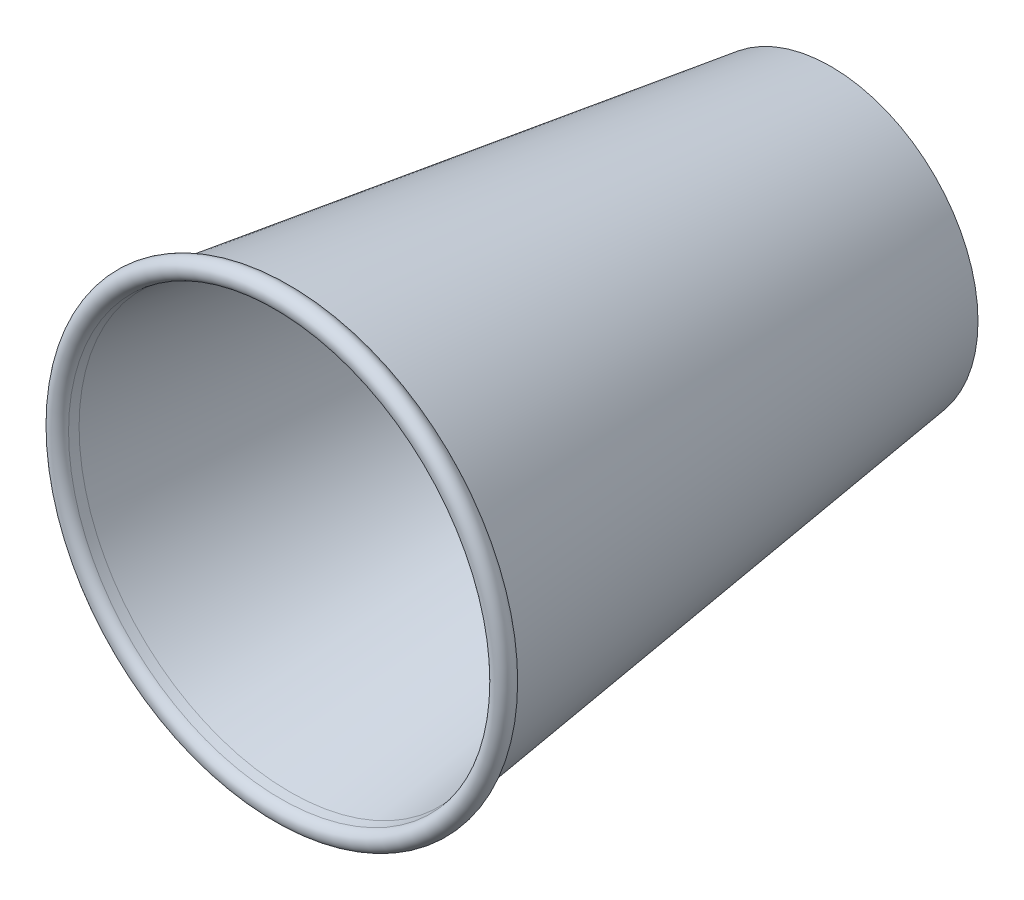
ISO-10303-21;
HEADER;
FILE_DESCRIPTION(('STEP AP214'),'2;1');
FILE_NAME('part.step','',(''),(''),'','','');
FILE_SCHEMA(('AUTOMOTIVE_DESIGN { 1 0 10303 214 1 1 1 1 }'));
ENDSEC;
DATA;
#1=APPLICATION_CONTEXT('core data for automotive mechanical design processes');
#2=APPLICATION_PROTOCOL_DEFINITION('international standard','automotive_design',2000,#1);
#3=PRODUCT_CONTEXT('',#1,'mechanical');
#4=PRODUCT('Part','Part','',(#3));
#5=PRODUCT_RELATED_PRODUCT_CATEGORY('part','',(#4));
#6=PRODUCT_DEFINITION_FORMATION('','',#4);
#7=PRODUCT_DEFINITION_CONTEXT('part definition',#1,'design');
#8=PRODUCT_DEFINITION('design','',#6,#7);
#9=PRODUCT_DEFINITION_SHAPE('','',#8);
#10=(LENGTH_UNIT() NAMED_UNIT(*) SI_UNIT(.MILLI.,.METRE.));
#11=(NAMED_UNIT(*) PLANE_ANGLE_UNIT() SI_UNIT($,.RADIAN.));
#12=(NAMED_UNIT(*) SI_UNIT($,.STERADIAN.) SOLID_ANGLE_UNIT());
#13=UNCERTAINTY_MEASURE_WITH_UNIT(LENGTH_MEASURE(1.E-05),#10,'distance_accuracy_value','');
#14=(GEOMETRIC_REPRESENTATION_CONTEXT(3) GLOBAL_UNCERTAINTY_ASSIGNED_CONTEXT((#13)) GLOBAL_UNIT_ASSIGNED_CONTEXT((#10,
#11,#12)) REPRESENTATION_CONTEXT('',''));
#15=CARTESIAN_POINT('',(0.,0.,0.));
#16=DIRECTION('',(0.,0.,1.));
#17=DIRECTION('',(1.,0.,0.));
#18=AXIS2_PLACEMENT_3D('',#15,#16,#17);
#19=CARTESIAN_POINT('',(0.,0.,110.4));
#20=DIRECTION('',(0.,0.,1.));
#21=DIRECTION('',(1.,0.,0.));
#22=AXIS2_PLACEMENT_3D('',#19,#20,#21);
#23=CONICAL_SURFACE('',#22,44.616104,0.135425968152299);
#24=CARTESIAN_POINT('',(0.,0.,0.));
#25=DIRECTION('',(0.,0.,-1.));
#26=DIRECTION('',(-1.,0.,0.));
#27=AXIS2_PLACEMENT_3D('',#24,#25,#26);
#28=CIRCLE('',#27,29.573);
#29=CARTESIAN_POINT('',(-29.573,0.,0.));
#30=VERTEX_POINT('',#29);
#31=EDGE_CURVE('E71',#30,#30,#28,.T.);
#32=ORIENTED_EDGE('',*,*,#31,.F.);
#33=EDGE_LOOP('',(#32));
#34=FACE_BOUND('',#33,.T.);
#35=CARTESIAN_POINT('',(0.,0.,108.43739979684));
#36=DIRECTION('',(0.,0.,1.));
#37=DIRECTION('',(1.,0.,0.));
#38=AXIS2_PLACEMENT_3D('',#35,#36,#37);
#39=CIRCLE('',#38,44.3486800963174);
#40=CARTESIAN_POINT('',(44.3486800963174,0.,108.43739979684));
#41=VERTEX_POINT('',#40);
#42=EDGE_CURVE('E57',#41,#41,#39,.T.);
#43=ORIENTED_EDGE('',*,*,#42,.F.);
#44=EDGE_LOOP('',(#43));
#45=FACE_BOUND('',#44,.T.);
#46=ADVANCED_FACE('F43',(#34,#45),#23,.T.);
#47=CARTESIAN_POINT('',(0.,0.,3.));
#48=DIRECTION('',(0.,0.,1.));
#49=DIRECTION('',(1.,0.,0.));
#50=AXIS2_PLACEMENT_3D('',#47,#48,#49);
#51=PLANE('',#50);
#52=CARTESIAN_POINT('',(0.,0.,3.));
#53=DIRECTION('',(0.,0.,-1.));
#54=DIRECTION('',(-1.,0.,0.));
#55=AXIS2_PLACEMENT_3D('',#52,#53,#54);
#56=CIRCLE('',#55,27.6);
#57=CARTESIAN_POINT('',(-27.6,0.,3.));
#58=VERTEX_POINT('',#57);
#59=EDGE_CURVE('E62',#58,#58,#56,.T.);
#60=ORIENTED_EDGE('',*,*,#59,.T.);
#61=EDGE_LOOP('',(#60));
#62=FACE_BOUND('',#61,.T.);
#63=ADVANCED_FACE('F93',(#62),#51,.F.);
#64=CARTESIAN_POINT('',(0.,0.,-50.));
#65=DIRECTION('',(0.,0.,-1.));
#66=DIRECTION('',(-1.,0.,0.));
#67=AXIS2_PLACEMENT_3D('',#64,#65,#66);
#68=CYLINDRICAL_SURFACE('',#67,27.6);
#69=ORIENTED_EDGE('',*,*,#59,.F.);
#70=EDGE_LOOP('',(#69));
#71=FACE_BOUND('',#70,.T.);
#72=CARTESIAN_POINT('',(0.,0.,0.));
#73=DIRECTION('',(0.,0.,-1.));
#74=DIRECTION('',(-1.,0.,0.));
#75=AXIS2_PLACEMENT_3D('',#72,#73,#74);
#76=CIRCLE('',#75,27.6);
#77=CARTESIAN_POINT('',(-27.6,0.,0.));
#78=VERTEX_POINT('',#77);
#79=EDGE_CURVE('E68',#78,#78,#76,.T.);
#80=ORIENTED_EDGE('',*,*,#79,.T.);
#81=EDGE_LOOP('',(#80));
#82=FACE_BOUND('',#81,.T.);
#83=ADVANCED_FACE('F98',(#71,#82),#68,.F.);
#84=CARTESIAN_POINT('',(27.6,0.,0.));
#85=DIRECTION('',(0.,0.,1.));
#86=DIRECTION('',(1.,0.,0.));
#87=AXIS2_PLACEMENT_3D('',#84,#85,#86);
#88=PLANE('',#87);
#89=ORIENTED_EDGE('',*,*,#79,.F.);
#90=EDGE_LOOP('',(#89));
#91=FACE_BOUND('',#90,.T.);
#92=ORIENTED_EDGE('',*,*,#31,.T.);
#93=EDGE_LOOP('',(#92));
#94=FACE_BOUND('',#93,.T.);
#95=ADVANCED_FACE('F90',(#91,#94),#88,.F.);
#96=CARTESIAN_POINT('',(0.,0.,110.4));
#97=DIRECTION('',(0.,0.,-1.));
#98=DIRECTION('',(-1.,0.,0.));
#99=AXIS2_PLACEMENT_3D('',#96,#97,#98);
#100=TOROIDAL_SURFACE('',#99,44.616104,1.980736);
#101=CARTESIAN_POINT('',(0.,0.,110.631046562166));
#102=DIRECTION('',(0.,0.,-1.));
#103=DIRECTION('',(-1.,0.,0.));
#104=AXIS2_PLACEMENT_3D('',#101,#102,#103);
#105=CIRCLE('',#104,42.6488895765558);
#106=CARTESIAN_POINT('',(-42.6488895765558,0.,110.631046562166));
#107=VERTEX_POINT('',#106);
#108=EDGE_CURVE('E51',#107,#107,#105,.T.);
#109=ORIENTED_EDGE('',*,*,#108,.T.);
#110=EDGE_LOOP('',(#109));
#111=FACE_BOUND('',#110,.T.);
#112=ORIENTED_EDGE('',*,*,#42,.T.);
#113=EDGE_LOOP('',(#112));
#114=FACE_BOUND('',#113,.T.);
#115=ADVANCED_FACE('F84',(#111,#114),#100,.T.);
#116=CARTESIAN_POINT('',(28.23035,0.,5.));
#117=DIRECTION('',(0.,0.,-1.));
#118=DIRECTION('',(-1.,0.,0.));
#119=AXIS2_PLACEMENT_3D('',#116,#117,#118);
#120=PLANE('',#119);
#121=CARTESIAN_POINT('',(0.,0.,5.));
#122=DIRECTION('',(0.,0.,-1.));
#123=DIRECTION('',(-1.,0.,0.));
#124=AXIS2_PLACEMENT_3D('',#121,#122,#123);
#125=CIRCLE('',#124,28.23035);
#126=CARTESIAN_POINT('',(-28.23035,0.,5.));
#127=VERTEX_POINT('',#126);
#128=EDGE_CURVE('E75',#127,#127,#125,.T.);
#129=ORIENTED_EDGE('',*,*,#128,.F.);
#130=EDGE_LOOP('',(#129));
#131=FACE_BOUND('',#130,.T.);
#132=ADVANCED_FACE('F82',(#131),#120,.F.);
#133=CARTESIAN_POINT('',(0.,0.,5.));
#134=DIRECTION('',(0.,0.,1.));
#135=DIRECTION('',(1.,0.,0.));
#136=AXIS2_PLACEMENT_3D('',#133,#134,#135);
#137=CONICAL_SURFACE('',#136,28.23035,0.13582847243214);
#138=CARTESIAN_POINT('',(0.,0.,108.754608974612));
#139=DIRECTION('',(0.,0.,1.));
#140=DIRECTION('',(1.,0.,0.));
#141=AXIS2_PLACEMENT_3D('',#138,#139,#140);
#142=CIRCLE('',#141,42.4104924085603);
#143=CARTESIAN_POINT('',(42.4104924085603,0.,108.754608974612));
#144=VERTEX_POINT('',#143);
#145=EDGE_CURVE('E10',#144,#144,#142,.T.);
#146=ORIENTED_EDGE('',*,*,#145,.T.);
#147=EDGE_LOOP('',(#146));
#148=FACE_BOUND('',#147,.T.);
#149=ORIENTED_EDGE('',*,*,#128,.T.);
#150=EDGE_LOOP('',(#149));
#151=FACE_BOUND('',#150,.T.);
#152=ADVANCED_FACE('F80',(#148,#151),#137,.F.);
#153=CARTESIAN_POINT('',(0.,0.,122.295728890629));
#154=DIRECTION('',(0.,0.,-1.));
#155=DIRECTION('',(-1.,0.,0.));
#156=AXIS2_PLACEMENT_3D('',#153,#154,#155);
#157=DEGENERATE_TOROIDAL_SURFACE('',#156,56.6684562708643,100.,.F.);
#158=ORIENTED_EDGE('',*,*,#145,.F.);
#159=EDGE_LOOP('',(#158));
#160=FACE_BOUND('',#159,.T.);
#161=ORIENTED_EDGE('',*,*,#108,.F.);
#162=EDGE_LOOP('',(#161));
#163=FACE_BOUND('',#162,.T.);
#164=ADVANCED_FACE('F45',(#160,#163),#157,.T.);
#165=CLOSED_SHELL('',(#46,#63,#83,#95,#115,#132,#152,#164));
#166=MANIFOLD_SOLID_BREP('B2',#165);
#167=ADVANCED_BREP_SHAPE_REPRESENTATION('',(#18,#166),#14);
#168=SHAPE_DEFINITION_REPRESENTATION(#9,#167);
ENDSEC;
END-ISO-10303-21;
